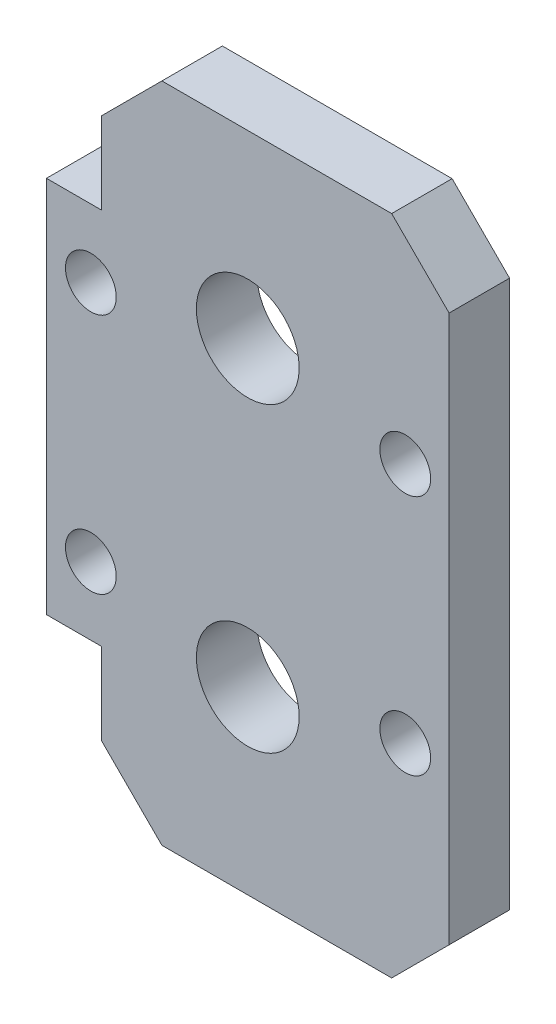
ISO-10303-21;
HEADER;
FILE_DESCRIPTION(('STEP AP214'),'2;1');
FILE_NAME('part.step','',(''),(''),'','','');
FILE_SCHEMA(('AUTOMOTIVE_DESIGN { 1 0 10303 214 1 1 1 1 }'));
ENDSEC;
DATA;
#1=APPLICATION_CONTEXT('core data for automotive mechanical design processes');
#2=APPLICATION_PROTOCOL_DEFINITION('international standard','automotive_design',2000,#1);
#3=PRODUCT_CONTEXT('',#1,'mechanical');
#4=PRODUCT('Part','Part','',(#3));
#5=PRODUCT_RELATED_PRODUCT_CATEGORY('part','',(#4));
#6=PRODUCT_DEFINITION_FORMATION('','',#4);
#7=PRODUCT_DEFINITION_CONTEXT('part definition',#1,'design');
#8=PRODUCT_DEFINITION('design','',#6,#7);
#9=PRODUCT_DEFINITION_SHAPE('','',#8);
#10=(LENGTH_UNIT() NAMED_UNIT(*) SI_UNIT(.MILLI.,.METRE.));
#11=(NAMED_UNIT(*) PLANE_ANGLE_UNIT() SI_UNIT($,.RADIAN.));
#12=(NAMED_UNIT(*) SI_UNIT($,.STERADIAN.) SOLID_ANGLE_UNIT());
#13=UNCERTAINTY_MEASURE_WITH_UNIT(LENGTH_MEASURE(1.E-05),#10,'distance_accuracy_value','');
#14=(GEOMETRIC_REPRESENTATION_CONTEXT(3) GLOBAL_UNCERTAINTY_ASSIGNED_CONTEXT((#13)) GLOBAL_UNIT_ASSIGNED_CONTEXT((#10,
#11,#12)) REPRESENTATION_CONTEXT('',''));
#15=CARTESIAN_POINT('',(0.,0.,0.));
#16=DIRECTION('',(0.,0.,1.));
#17=DIRECTION('',(1.,0.,0.));
#18=AXIS2_PLACEMENT_3D('',#15,#16,#17);
#19=CARTESIAN_POINT('',(0.,0.,5.));
#20=DIRECTION('',(0.,0.,1.));
#21=DIRECTION('',(1.,0.,0.));
#22=AXIS2_PLACEMENT_3D('',#19,#20,#21);
#23=PLANE('',#22);
#24=CARTESIAN_POINT('',(13.0236850069192,9.99869022073703,5.));
#25=DIRECTION('',(0.,0.,1.));
#26=DIRECTION('',(1.,0.,0.));
#27=AXIS2_PLACEMENT_3D('',#24,#25,#26);
#28=CIRCLE('',#27,2.1);
#29=CARTESIAN_POINT('',(15.1236850069192,9.99869022073703,5.));
#30=VERTEX_POINT('',#29);
#31=EDGE_CURVE('E315',#30,#30,#28,.T.);
#32=ORIENTED_EDGE('',*,*,#31,.F.);
#33=EDGE_LOOP('',(#32));
#34=FACE_BOUND('',#33,.T.);
#35=CARTESIAN_POINT('',(-12.9763005789078,-10.0012986914376,5.));
#36=DIRECTION('',(0.,0.,1.));
#37=DIRECTION('',(1.,0.,0.));
#38=AXIS2_PLACEMENT_3D('',#35,#36,#37);
#39=CIRCLE('',#38,2.1);
#40=CARTESIAN_POINT('',(-10.8763005789078,-10.0012986914376,5.));
#41=VERTEX_POINT('',#40);
#42=EDGE_CURVE('E312',#41,#41,#39,.T.);
#43=ORIENTED_EDGE('',*,*,#42,.F.);
#44=EDGE_LOOP('',(#43));
#45=FACE_BOUND('',#44,.T.);
#46=CARTESIAN_POINT('',(-12.9763005789078,9.99869022073703,5.));
#47=DIRECTION('',(0.,0.,1.));
#48=DIRECTION('',(1.,0.,0.));
#49=AXIS2_PLACEMENT_3D('',#46,#47,#48);
#50=CIRCLE('',#49,2.1);
#51=CARTESIAN_POINT('',(-10.8763005789078,9.99869022073703,5.));
#52=VERTEX_POINT('',#51);
#53=EDGE_CURVE('E292',#52,#52,#50,.T.);
#54=ORIENTED_EDGE('',*,*,#53,.F.);
#55=EDGE_LOOP('',(#54));
#56=FACE_BOUND('',#55,.T.);
#57=CARTESIAN_POINT('',(13.0236850069192,-10.0012986914376,5.));
#58=DIRECTION('',(0.,0.,1.));
#59=DIRECTION('',(1.,0.,0.));
#60=AXIS2_PLACEMENT_3D('',#57,#58,#59);
#61=CIRCLE('',#60,2.1);
#62=CARTESIAN_POINT('',(15.1236850069192,-10.0012986914376,5.));
#63=VERTEX_POINT('',#62);
#64=EDGE_CURVE('E308',#63,#63,#61,.T.);
#65=ORIENTED_EDGE('',*,*,#64,.F.);
#66=EDGE_LOOP('',(#65));
#67=FACE_BOUND('',#66,.T.);
#68=CARTESIAN_POINT('',(0.,12.485,5.));
#69=DIRECTION('',(0.,0.,1.));
#70=DIRECTION('',(-1.,0.,0.));
#71=AXIS2_PLACEMENT_3D('',#68,#69,#70);
#72=CIRCLE('',#71,4.25000000000001);
#73=CARTESIAN_POINT('',(-4.25000000000001,12.485,5.));
#74=VERTEX_POINT('',#73);
#75=EDGE_CURVE('E158',#74,#74,#72,.T.);
#76=ORIENTED_EDGE('',*,*,#75,.F.);
#77=EDGE_LOOP('',(#76));
#78=FACE_BOUND('',#77,.T.);
#79=DIRECTION('',(1.,0.,0.));
#80=VECTOR('',#79,1.);
#81=CARTESIAN_POINT('',(-7.09994432064375,-27.3750000000001,5.));
#82=LINE('',#81,#80);
#83=CARTESIAN_POINT('',(-7.09994432064375,-27.3750000000001,5.));
#84=VERTEX_POINT('',#83);
#85=CARTESIAN_POINT('',(11.9000556793563,-27.3750000000001,5.));
#86=VERTEX_POINT('',#85);
#87=EDGE_CURVE('E177',#84,#86,#82,.T.);
#88=ORIENTED_EDGE('',*,*,#87,.T.);
#89=DIRECTION('',(0.707106781186548,0.707106781186547,0.));
#90=VECTOR('',#89,1.);
#91=CARTESIAN_POINT('',(11.9000556793563,-27.3750000000001,5.));
#92=LINE('',#91,#90);
#93=CARTESIAN_POINT('',(16.6500556793564,-22.625,5.));
#94=VERTEX_POINT('',#93);
#95=EDGE_CURVE('E105',#86,#94,#92,.T.);
#96=ORIENTED_EDGE('',*,*,#95,.T.);
#97=DIRECTION('',(0.,1.,0.));
#98=VECTOR('',#97,1.);
#99=CARTESIAN_POINT('',(16.6500556793564,-22.625,5.));
#100=LINE('',#99,#98);
#101=CARTESIAN_POINT('',(16.6500556793564,22.625,5.));
#102=VERTEX_POINT('',#101);
#103=EDGE_CURVE('E204',#94,#102,#100,.T.);
#104=ORIENTED_EDGE('',*,*,#103,.T.);
#105=DIRECTION('',(-0.707106781186548,0.707106781186547,0.));
#106=VECTOR('',#105,1.);
#107=CARTESIAN_POINT('',(11.9000556793563,27.3750000000001,5.));
#108=LINE('',#107,#106);
#109=CARTESIAN_POINT('',(11.9000556793563,27.3750000000001,5.));
#110=VERTEX_POINT('',#109);
#111=EDGE_CURVE('E223',#102,#110,#108,.T.);
#112=ORIENTED_EDGE('',*,*,#111,.T.);
#113=DIRECTION('',(-1.,0.,0.));
#114=VECTOR('',#113,1.);
#115=CARTESIAN_POINT('',(-7.09994432064375,27.3750000000001,5.));
#116=LINE('',#115,#114);
#117=CARTESIAN_POINT('',(-7.09994432064375,27.3750000000001,5.));
#118=VERTEX_POINT('',#117);
#119=EDGE_CURVE('E220',#110,#118,#116,.T.);
#120=ORIENTED_EDGE('',*,*,#119,.T.);
#121=DIRECTION('',(-0.707106781186547,-0.707106781186548,0.));
#122=VECTOR('',#121,1.);
#123=CARTESIAN_POINT('',(-12.0999443206437,22.3750000000001,5.));
#124=LINE('',#123,#122);
#125=CARTESIAN_POINT('',(-12.0999443206437,22.3750000000001,5.));
#126=VERTEX_POINT('',#125);
#127=EDGE_CURVE('E222',#118,#126,#124,.T.);
#128=ORIENTED_EDGE('',*,*,#127,.T.);
#129=DIRECTION('',(0.,-1.,0.));
#130=VECTOR('',#129,1.);
#131=CARTESIAN_POINT('',(-12.0999443206437,15.625,5.));
#132=LINE('',#131,#130);
#133=CARTESIAN_POINT('',(-12.0999443206437,15.625,5.));
#134=VERTEX_POINT('',#133);
#135=EDGE_CURVE('E225',#126,#134,#132,.T.);
#136=ORIENTED_EDGE('',*,*,#135,.T.);
#137=DIRECTION('',(-1.,0.,0.));
#138=VECTOR('',#137,1.);
#139=CARTESIAN_POINT('',(-16.65,15.625,5.));
#140=LINE('',#139,#138);
#141=CARTESIAN_POINT('',(-16.65,15.625,5.));
#142=VERTEX_POINT('',#141);
#143=EDGE_CURVE('E231',#134,#142,#140,.T.);
#144=ORIENTED_EDGE('',*,*,#143,.T.);
#145=DIRECTION('',(0.,-1.,0.));
#146=VECTOR('',#145,1.);
#147=CARTESIAN_POINT('',(-16.65,-15.625,5.));
#148=LINE('',#147,#146);
#149=CARTESIAN_POINT('',(-16.65,-15.625,5.));
#150=VERTEX_POINT('',#149);
#151=EDGE_CURVE('E136',#142,#150,#148,.T.);
#152=ORIENTED_EDGE('',*,*,#151,.T.);
#153=DIRECTION('',(1.,0.,0.));
#154=VECTOR('',#153,1.);
#155=CARTESIAN_POINT('',(-16.65,-15.625,5.));
#156=LINE('',#155,#154);
#157=CARTESIAN_POINT('',(-12.0999443206437,-15.625,5.));
#158=VERTEX_POINT('',#157);
#159=EDGE_CURVE('E130',#150,#158,#156,.T.);
#160=ORIENTED_EDGE('',*,*,#159,.T.);
#161=DIRECTION('',(0.,-1.,0.));
#162=VECTOR('',#161,1.);
#163=CARTESIAN_POINT('',(-12.0999443206437,-15.625,5.));
#164=LINE('',#163,#162);
#165=CARTESIAN_POINT('',(-12.0999443206437,-22.3750000000001,5.));
#166=VERTEX_POINT('',#165);
#167=EDGE_CURVE('E134',#158,#166,#164,.T.);
#168=ORIENTED_EDGE('',*,*,#167,.T.);
#169=DIRECTION('',(0.707106781186547,-0.707106781186548,0.));
#170=VECTOR('',#169,1.);
#171=CARTESIAN_POINT('',(-12.0999443206437,-22.3750000000001,5.));
#172=LINE('',#171,#170);
#173=EDGE_CURVE('E50',#166,#84,#172,.T.);
#174=ORIENTED_EDGE('',*,*,#173,.T.);
#175=EDGE_LOOP('',(#88,#96,#104,#112,#120,#128,#136,#144,#152,#160,#168,#174));
#176=FACE_BOUND('',#175,.T.);
#177=CARTESIAN_POINT('',(0.,-12.485,5.));
#178=DIRECTION('',(0.,0.,1.));
#179=DIRECTION('',(1.,0.,0.));
#180=AXIS2_PLACEMENT_3D('',#177,#178,#179);
#181=CIRCLE('',#180,4.25000000000001);
#182=CARTESIAN_POINT('',(4.25000000000001,-12.485,5.));
#183=VERTEX_POINT('',#182);
#184=EDGE_CURVE('E319',#183,#183,#181,.T.);
#185=ORIENTED_EDGE('',*,*,#184,.F.);
#186=EDGE_LOOP('',(#185));
#187=FACE_BOUND('',#186,.T.);
#188=ADVANCED_FACE('F33',(#34,#45,#56,#67,#78,#176,#187),#23,.T.);
#189=CARTESIAN_POINT('',(0.,0.,0.));
#190=DIRECTION('',(0.,0.,1.));
#191=DIRECTION('',(1.,0.,0.));
#192=AXIS2_PLACEMENT_3D('',#189,#190,#191);
#193=PLANE('',#192);
#194=CARTESIAN_POINT('',(13.0236850069192,9.99869022073703,0.));
#195=DIRECTION('',(0.,0.,-1.));
#196=DIRECTION('',(-1.,0.,0.));
#197=AXIS2_PLACEMENT_3D('',#194,#195,#196);
#198=CIRCLE('',#197,2.1);
#199=CARTESIAN_POINT('',(10.9236850069192,9.99869022073703,0.));
#200=VERTEX_POINT('',#199);
#201=EDGE_CURVE('E300',#200,#200,#198,.T.);
#202=ORIENTED_EDGE('',*,*,#201,.F.);
#203=EDGE_LOOP('',(#202));
#204=FACE_BOUND('',#203,.T.);
#205=CARTESIAN_POINT('',(-12.9763005789078,-10.0012986914376,0.));
#206=DIRECTION('',(0.,0.,-1.));
#207=DIRECTION('',(-1.,0.,0.));
#208=AXIS2_PLACEMENT_3D('',#205,#206,#207);
#209=CIRCLE('',#208,2.1);
#210=CARTESIAN_POINT('',(-15.0763005789078,-10.0012986914376,0.));
#211=VERTEX_POINT('',#210);
#212=EDGE_CURVE('E297',#211,#211,#209,.T.);
#213=ORIENTED_EDGE('',*,*,#212,.F.);
#214=EDGE_LOOP('',(#213));
#215=FACE_BOUND('',#214,.T.);
#216=CARTESIAN_POINT('',(-12.9763005789078,9.99869022073703,0.));
#217=DIRECTION('',(0.,0.,-1.));
#218=DIRECTION('',(-1.,0.,0.));
#219=AXIS2_PLACEMENT_3D('',#216,#217,#218);
#220=CIRCLE('',#219,2.1);
#221=CARTESIAN_POINT('',(-15.0763005789078,9.99869022073703,0.));
#222=VERTEX_POINT('',#221);
#223=EDGE_CURVE('E295',#222,#222,#220,.T.);
#224=ORIENTED_EDGE('',*,*,#223,.F.);
#225=EDGE_LOOP('',(#224));
#226=FACE_BOUND('',#225,.T.);
#227=CARTESIAN_POINT('',(13.0236850069192,-10.0012986914376,0.));
#228=DIRECTION('',(0.,0.,-1.));
#229=DIRECTION('',(-1.,0.,0.));
#230=AXIS2_PLACEMENT_3D('',#227,#228,#229);
#231=CIRCLE('',#230,2.1);
#232=CARTESIAN_POINT('',(10.9236850069192,-10.0012986914376,0.));
#233=VERTEX_POINT('',#232);
#234=EDGE_CURVE('E304',#233,#233,#231,.T.);
#235=ORIENTED_EDGE('',*,*,#234,.F.);
#236=EDGE_LOOP('',(#235));
#237=FACE_BOUND('',#236,.T.);
#238=DIRECTION('',(1.,0.,0.));
#239=VECTOR('',#238,1.);
#240=CARTESIAN_POINT('',(-7.09994432064375,-27.3750000000001,0.));
#241=LINE('',#240,#239);
#242=CARTESIAN_POINT('',(-7.09994432064375,-27.3750000000001,0.));
#243=VERTEX_POINT('',#242);
#244=CARTESIAN_POINT('',(11.9000556793563,-27.3750000000001,0.));
#245=VERTEX_POINT('',#244);
#246=EDGE_CURVE('E154',#243,#245,#241,.T.);
#247=ORIENTED_EDGE('',*,*,#246,.F.);
#248=DIRECTION('',(0.707106781186547,-0.707106781186548,0.));
#249=VECTOR('',#248,1.);
#250=CARTESIAN_POINT('',(-12.0999443206437,-22.3750000000001,0.));
#251=LINE('',#250,#249);
#252=CARTESIAN_POINT('',(-12.0999443206437,-22.3750000000001,0.));
#253=VERTEX_POINT('',#252);
#254=EDGE_CURVE('E97',#253,#243,#251,.T.);
#255=ORIENTED_EDGE('',*,*,#254,.F.);
#256=DIRECTION('',(0.,-1.,0.));
#257=VECTOR('',#256,1.);
#258=CARTESIAN_POINT('',(-12.0999443206437,-15.625,0.));
#259=LINE('',#258,#257);
#260=CARTESIAN_POINT('',(-12.0999443206437,-15.625,0.));
#261=VERTEX_POINT('',#260);
#262=EDGE_CURVE('E91',#261,#253,#259,.T.);
#263=ORIENTED_EDGE('',*,*,#262,.F.);
#264=DIRECTION('',(1.,0.,0.));
#265=VECTOR('',#264,1.);
#266=CARTESIAN_POINT('',(-16.65,-15.625,0.));
#267=LINE('',#266,#265);
#268=CARTESIAN_POINT('',(-16.65,-15.625,0.));
#269=VERTEX_POINT('',#268);
#270=EDGE_CURVE('E144',#269,#261,#267,.T.);
#271=ORIENTED_EDGE('',*,*,#270,.F.);
#272=DIRECTION('',(0.,-1.,0.));
#273=VECTOR('',#272,1.);
#274=CARTESIAN_POINT('',(-16.65,-15.625,0.));
#275=LINE('',#274,#273);
#276=CARTESIAN_POINT('',(-16.65,15.625,0.));
#277=VERTEX_POINT('',#276);
#278=EDGE_CURVE('E172',#277,#269,#275,.T.);
#279=ORIENTED_EDGE('',*,*,#278,.F.);
#280=DIRECTION('',(-1.,0.,0.));
#281=VECTOR('',#280,1.);
#282=CARTESIAN_POINT('',(-16.65,15.625,0.));
#283=LINE('',#282,#281);
#284=CARTESIAN_POINT('',(-12.0999443206437,15.625,0.));
#285=VERTEX_POINT('',#284);
#286=EDGE_CURVE('E170',#285,#277,#283,.T.);
#287=ORIENTED_EDGE('',*,*,#286,.F.);
#288=DIRECTION('',(0.,-1.,0.));
#289=VECTOR('',#288,1.);
#290=CARTESIAN_POINT('',(-12.0999443206437,15.625,0.));
#291=LINE('',#290,#289);
#292=CARTESIAN_POINT('',(-12.0999443206437,22.3750000000001,0.));
#293=VERTEX_POINT('',#292);
#294=EDGE_CURVE('E168',#293,#285,#291,.T.);
#295=ORIENTED_EDGE('',*,*,#294,.F.);
#296=DIRECTION('',(-0.707106781186547,-0.707106781186548,0.));
#297=VECTOR('',#296,1.);
#298=CARTESIAN_POINT('',(-12.0999443206437,22.3750000000001,0.));
#299=LINE('',#298,#297);
#300=CARTESIAN_POINT('',(-7.09994432064375,27.3750000000001,0.));
#301=VERTEX_POINT('',#300);
#302=EDGE_CURVE('E166',#301,#293,#299,.T.);
#303=ORIENTED_EDGE('',*,*,#302,.F.);
#304=DIRECTION('',(-1.,0.,0.));
#305=VECTOR('',#304,1.);
#306=CARTESIAN_POINT('',(-7.09994432064375,27.3750000000001,0.));
#307=LINE('',#306,#305);
#308=CARTESIAN_POINT('',(11.9000556793563,27.3750000000001,0.));
#309=VERTEX_POINT('',#308);
#310=EDGE_CURVE('E164',#309,#301,#307,.T.);
#311=ORIENTED_EDGE('',*,*,#310,.F.);
#312=DIRECTION('',(-0.707106781186548,0.707106781186547,0.));
#313=VECTOR('',#312,1.);
#314=CARTESIAN_POINT('',(11.9000556793563,27.3750000000001,0.));
#315=LINE('',#314,#313);
#316=CARTESIAN_POINT('',(16.6500556793564,22.625,0.));
#317=VERTEX_POINT('',#316);
#318=EDGE_CURVE('E162',#317,#309,#315,.T.);
#319=ORIENTED_EDGE('',*,*,#318,.F.);
#320=DIRECTION('',(0.,1.,0.));
#321=VECTOR('',#320,1.);
#322=CARTESIAN_POINT('',(16.6500556793564,-22.625,0.));
#323=LINE('',#322,#321);
#324=CARTESIAN_POINT('',(16.6500556793564,-22.625,0.));
#325=VERTEX_POINT('',#324);
#326=EDGE_CURVE('E160',#325,#317,#323,.T.);
#327=ORIENTED_EDGE('',*,*,#326,.F.);
#328=DIRECTION('',(0.707106781186548,0.707106781186547,0.));
#329=VECTOR('',#328,1.);
#330=CARTESIAN_POINT('',(11.9000556793563,-27.3750000000001,0.));
#331=LINE('',#330,#329);
#332=EDGE_CURVE('E157',#245,#325,#331,.T.);
#333=ORIENTED_EDGE('',*,*,#332,.F.);
#334=EDGE_LOOP('',(#247,#255,#263,#271,#279,#287,#295,#303,#311,#319,#327,#333));
#335=FACE_BOUND('',#334,.T.);
#336=CARTESIAN_POINT('',(0.,12.485,0.));
#337=DIRECTION('',(0.,0.,1.));
#338=DIRECTION('',(-1.,0.,0.));
#339=AXIS2_PLACEMENT_3D('',#336,#337,#338);
#340=CIRCLE('',#339,4.25000000000001);
#341=CARTESIAN_POINT('',(-4.25000000000001,12.485,0.));
#342=VERTEX_POINT('',#341);
#343=EDGE_CURVE('E322',#342,#342,#340,.T.);
#344=ORIENTED_EDGE('',*,*,#343,.T.);
#345=EDGE_LOOP('',(#344));
#346=FACE_BOUND('',#345,.T.);
#347=CARTESIAN_POINT('',(0.,-12.485,0.));
#348=DIRECTION('',(0.,0.,1.));
#349=DIRECTION('',(1.,0.,0.));
#350=AXIS2_PLACEMENT_3D('',#347,#348,#349);
#351=CIRCLE('',#350,4.25000000000001);
#352=CARTESIAN_POINT('',(4.25000000000001,-12.485,0.));
#353=VERTEX_POINT('',#352);
#354=EDGE_CURVE('E318',#353,#353,#351,.T.);
#355=ORIENTED_EDGE('',*,*,#354,.T.);
#356=EDGE_LOOP('',(#355));
#357=FACE_BOUND('',#356,.T.);
#358=ADVANCED_FACE('F208',(#204,#215,#226,#237,#335,#346,#357),#193,.F.);
#359=CARTESIAN_POINT('',(-7.09994432064375,-27.3750000000001,5.));
#360=DIRECTION('',(0.,1.,0.));
#361=DIRECTION('',(0.,0.,1.));
#362=AXIS2_PLACEMENT_3D('',#359,#360,#361);
#363=PLANE('',#362);
#364=ORIENTED_EDGE('',*,*,#246,.T.);
#365=DIRECTION('',(0.,0.,-1.));
#366=VECTOR('',#365,1.);
#367=CARTESIAN_POINT('',(11.9000556793563,-27.3750000000001,5.));
#368=LINE('',#367,#366);
#369=EDGE_CURVE('E11',#86,#245,#368,.T.);
#370=ORIENTED_EDGE('',*,*,#369,.F.);
#371=ORIENTED_EDGE('',*,*,#87,.F.);
#372=DIRECTION('',(0.,0.,-1.));
#373=VECTOR('',#372,1.);
#374=CARTESIAN_POINT('',(-7.09994432064375,-27.3750000000001,5.));
#375=LINE('',#374,#373);
#376=EDGE_CURVE('E150',#84,#243,#375,.T.);
#377=ORIENTED_EDGE('',*,*,#376,.T.);
#378=EDGE_LOOP('',(#364,#370,#371,#377));
#379=FACE_BOUND('',#378,.T.);
#380=ADVANCED_FACE('F35',(#379),#363,.F.);
#381=CARTESIAN_POINT('',(11.9000556793563,-27.3750000000001,5.));
#382=DIRECTION('',(-0.707106781186547,0.707106781186548,0.));
#383=DIRECTION('',(-0.707106781186548,-0.707106781186547,0.));
#384=AXIS2_PLACEMENT_3D('',#381,#382,#383);
#385=PLANE('',#384);
#386=ORIENTED_EDGE('',*,*,#332,.T.);
#387=DIRECTION('',(0.,0.,-1.));
#388=VECTOR('',#387,1.);
#389=CARTESIAN_POINT('',(16.6500556793564,-22.625,5.));
#390=LINE('',#389,#388);
#391=EDGE_CURVE('E42',#94,#325,#390,.T.);
#392=ORIENTED_EDGE('',*,*,#391,.F.);
#393=ORIENTED_EDGE('',*,*,#95,.F.);
#394=ORIENTED_EDGE('',*,*,#369,.T.);
#395=EDGE_LOOP('',(#386,#392,#393,#394));
#396=FACE_BOUND('',#395,.T.);
#397=ADVANCED_FACE('F449',(#396),#385,.F.);
#398=CARTESIAN_POINT('',(16.6500556793564,-22.625,5.));
#399=DIRECTION('',(-1.,0.,0.));
#400=DIRECTION('',(0.,0.,1.));
#401=AXIS2_PLACEMENT_3D('',#398,#399,#400);
#402=PLANE('',#401);
#403=ORIENTED_EDGE('',*,*,#326,.T.);
#404=DIRECTION('',(0.,0.,-1.));
#405=VECTOR('',#404,1.);
#406=CARTESIAN_POINT('',(16.6500556793564,22.625,5.));
#407=LINE('',#406,#405);
#408=EDGE_CURVE('E196',#102,#317,#407,.T.);
#409=ORIENTED_EDGE('',*,*,#408,.F.);
#410=ORIENTED_EDGE('',*,*,#103,.F.);
#411=ORIENTED_EDGE('',*,*,#391,.T.);
#412=EDGE_LOOP('',(#403,#409,#410,#411));
#413=FACE_BOUND('',#412,.T.);
#414=ADVANCED_FACE('F202',(#413),#402,.F.);
#415=CARTESIAN_POINT('',(11.9000556793563,27.3750000000001,5.));
#416=DIRECTION('',(-0.707106781186547,-0.707106781186548,0.));
#417=DIRECTION('',(0.707106781186548,-0.707106781186547,0.));
#418=AXIS2_PLACEMENT_3D('',#415,#416,#417);
#419=PLANE('',#418);
#420=ORIENTED_EDGE('',*,*,#318,.T.);
#421=DIRECTION('',(0.,0.,-1.));
#422=VECTOR('',#421,1.);
#423=CARTESIAN_POINT('',(11.9000556793563,27.3750000000001,5.));
#424=LINE('',#423,#422);
#425=EDGE_CURVE('E193',#110,#309,#424,.T.);
#426=ORIENTED_EDGE('',*,*,#425,.F.);
#427=ORIENTED_EDGE('',*,*,#111,.F.);
#428=ORIENTED_EDGE('',*,*,#408,.T.);
#429=EDGE_LOOP('',(#420,#426,#427,#428));
#430=FACE_BOUND('',#429,.T.);
#431=ADVANCED_FACE('F214',(#430),#419,.F.);
#432=CARTESIAN_POINT('',(-7.09994432064375,27.3750000000001,5.));
#433=DIRECTION('',(0.,-1.,0.));
#434=DIRECTION('',(0.,0.,-1.));
#435=AXIS2_PLACEMENT_3D('',#432,#433,#434);
#436=PLANE('',#435);
#437=ORIENTED_EDGE('',*,*,#310,.T.);
#438=DIRECTION('',(0.,0.,-1.));
#439=VECTOR('',#438,1.);
#440=CARTESIAN_POINT('',(-7.09994432064375,27.3750000000001,5.));
#441=LINE('',#440,#439);
#442=EDGE_CURVE('E190',#118,#301,#441,.T.);
#443=ORIENTED_EDGE('',*,*,#442,.F.);
#444=ORIENTED_EDGE('',*,*,#119,.F.);
#445=ORIENTED_EDGE('',*,*,#425,.T.);
#446=EDGE_LOOP('',(#437,#443,#444,#445));
#447=FACE_BOUND('',#446,.T.);
#448=ADVANCED_FACE('F218',(#447),#436,.F.);
#449=CARTESIAN_POINT('',(-12.0999443206437,22.3750000000001,5.));
#450=DIRECTION('',(0.707106781186548,-0.707106781186547,0.));
#451=DIRECTION('',(0.707106781186547,0.707106781186548,0.));
#452=AXIS2_PLACEMENT_3D('',#449,#450,#451);
#453=PLANE('',#452);
#454=ORIENTED_EDGE('',*,*,#302,.T.);
#455=DIRECTION('',(0.,0.,-1.));
#456=VECTOR('',#455,1.);
#457=CARTESIAN_POINT('',(-12.0999443206437,22.3750000000001,5.));
#458=LINE('',#457,#456);
#459=EDGE_CURVE('E187',#126,#293,#458,.T.);
#460=ORIENTED_EDGE('',*,*,#459,.F.);
#461=ORIENTED_EDGE('',*,*,#127,.F.);
#462=ORIENTED_EDGE('',*,*,#442,.T.);
#463=EDGE_LOOP('',(#454,#460,#461,#462));
#464=FACE_BOUND('',#463,.T.);
#465=ADVANCED_FACE('F418',(#464),#453,.F.);
#466=CARTESIAN_POINT('',(-12.0999443206437,15.625,5.));
#467=DIRECTION('',(1.,0.,0.));
#468=DIRECTION('',(0.,1.,0.));
#469=AXIS2_PLACEMENT_3D('',#466,#467,#468);
#470=PLANE('',#469);
#471=ORIENTED_EDGE('',*,*,#294,.T.);
#472=DIRECTION('',(0.,0.,-1.));
#473=VECTOR('',#472,1.);
#474=CARTESIAN_POINT('',(-12.0999443206437,15.625,5.));
#475=LINE('',#474,#473);
#476=EDGE_CURVE('E184',#134,#285,#475,.T.);
#477=ORIENTED_EDGE('',*,*,#476,.F.);
#478=ORIENTED_EDGE('',*,*,#135,.F.);
#479=ORIENTED_EDGE('',*,*,#459,.T.);
#480=EDGE_LOOP('',(#471,#477,#478,#479));
#481=FACE_BOUND('',#480,.T.);
#482=ADVANCED_FACE('F410',(#481),#470,.F.);
#483=CARTESIAN_POINT('',(-16.65,15.625,5.));
#484=DIRECTION('',(0.,-1.,0.));
#485=DIRECTION('',(1.,0.,0.));
#486=AXIS2_PLACEMENT_3D('',#483,#484,#485);
#487=PLANE('',#486);
#488=ORIENTED_EDGE('',*,*,#286,.T.);
#489=DIRECTION('',(0.,0.,-1.));
#490=VECTOR('',#489,1.);
#491=CARTESIAN_POINT('',(-16.65,15.625,5.));
#492=LINE('',#491,#490);
#493=EDGE_CURVE('E181',#142,#277,#492,.T.);
#494=ORIENTED_EDGE('',*,*,#493,.F.);
#495=ORIENTED_EDGE('',*,*,#143,.F.);
#496=ORIENTED_EDGE('',*,*,#476,.T.);
#497=EDGE_LOOP('',(#488,#494,#495,#496));
#498=FACE_BOUND('',#497,.T.);
#499=ADVANCED_FACE('F237',(#498),#487,.F.);
#500=CARTESIAN_POINT('',(-16.65,-15.625,5.));
#501=DIRECTION('',(1.,0.,0.));
#502=DIRECTION('',(0.,0.,-1.));
#503=AXIS2_PLACEMENT_3D('',#500,#501,#502);
#504=PLANE('',#503);
#505=ORIENTED_EDGE('',*,*,#278,.T.);
#506=DIRECTION('',(0.,0.,-1.));
#507=VECTOR('',#506,1.);
#508=CARTESIAN_POINT('',(-16.65,-15.625,5.));
#509=LINE('',#508,#507);
#510=EDGE_CURVE('E145',#150,#269,#509,.T.);
#511=ORIENTED_EDGE('',*,*,#510,.F.);
#512=ORIENTED_EDGE('',*,*,#151,.F.);
#513=ORIENTED_EDGE('',*,*,#493,.T.);
#514=EDGE_LOOP('',(#505,#511,#512,#513));
#515=FACE_BOUND('',#514,.T.);
#516=ADVANCED_FACE('F241',(#515),#504,.F.);
#517=CARTESIAN_POINT('',(-16.65,-15.625,5.));
#518=DIRECTION('',(0.,1.,0.));
#519=DIRECTION('',(-1.,0.,0.));
#520=AXIS2_PLACEMENT_3D('',#517,#518,#519);
#521=PLANE('',#520);
#522=ORIENTED_EDGE('',*,*,#270,.T.);
#523=DIRECTION('',(0.,0.,-1.));
#524=VECTOR('',#523,1.);
#525=CARTESIAN_POINT('',(-12.0999443206437,-15.625,5.));
#526=LINE('',#525,#524);
#527=EDGE_CURVE('E141',#158,#261,#526,.T.);
#528=ORIENTED_EDGE('',*,*,#527,.F.);
#529=ORIENTED_EDGE('',*,*,#159,.F.);
#530=ORIENTED_EDGE('',*,*,#510,.T.);
#531=EDGE_LOOP('',(#522,#528,#529,#530));
#532=FACE_BOUND('',#531,.T.);
#533=ADVANCED_FACE('F142',(#532),#521,.F.);
#534=CARTESIAN_POINT('',(-12.0999443206437,-15.625,5.));
#535=DIRECTION('',(1.,0.,0.));
#536=DIRECTION('',(0.,1.,0.));
#537=AXIS2_PLACEMENT_3D('',#534,#535,#536);
#538=PLANE('',#537);
#539=ORIENTED_EDGE('',*,*,#262,.T.);
#540=DIRECTION('',(0.,0.,-1.));
#541=VECTOR('',#540,1.);
#542=CARTESIAN_POINT('',(-12.0999443206437,-22.3750000000001,5.));
#543=LINE('',#542,#541);
#544=EDGE_CURVE('E146',#166,#253,#543,.T.);
#545=ORIENTED_EDGE('',*,*,#544,.F.);
#546=ORIENTED_EDGE('',*,*,#167,.F.);
#547=ORIENTED_EDGE('',*,*,#527,.T.);
#548=EDGE_LOOP('',(#539,#545,#546,#547));
#549=FACE_BOUND('',#548,.T.);
#550=ADVANCED_FACE('F148',(#549),#538,.F.);
#551=CARTESIAN_POINT('',(-12.0999443206437,-22.3750000000001,5.));
#552=DIRECTION('',(0.707106781186548,0.707106781186547,0.));
#553=DIRECTION('',(-0.707106781186547,0.707106781186548,0.));
#554=AXIS2_PLACEMENT_3D('',#551,#552,#553);
#555=PLANE('',#554);
#556=ORIENTED_EDGE('',*,*,#254,.T.);
#557=ORIENTED_EDGE('',*,*,#376,.F.);
#558=ORIENTED_EDGE('',*,*,#173,.F.);
#559=ORIENTED_EDGE('',*,*,#544,.T.);
#560=EDGE_LOOP('',(#556,#557,#558,#559));
#561=FACE_BOUND('',#560,.T.);
#562=ADVANCED_FACE('F245',(#561),#555,.F.);
#563=CARTESIAN_POINT('',(0.,12.485,5.));
#564=DIRECTION('',(0.,0.,-1.));
#565=DIRECTION('',(-1.,0.,0.));
#566=AXIS2_PLACEMENT_3D('',#563,#564,#565);
#567=CYLINDRICAL_SURFACE('',#566,4.25000000000001);
#568=ORIENTED_EDGE('',*,*,#75,.T.);
#569=EDGE_LOOP('',(#568));
#570=FACE_BOUND('',#569,.T.);
#571=ORIENTED_EDGE('',*,*,#343,.F.);
#572=EDGE_LOOP('',(#571));
#573=FACE_BOUND('',#572,.T.);
#574=ADVANCED_FACE('F247',(#570,#573),#567,.F.);
#575=CARTESIAN_POINT('',(0.,-12.485,5.));
#576=DIRECTION('',(0.,0.,-1.));
#577=DIRECTION('',(-1.,0.,0.));
#578=AXIS2_PLACEMENT_3D('',#575,#576,#577);
#579=CYLINDRICAL_SURFACE('',#578,4.25000000000001);
#580=ORIENTED_EDGE('',*,*,#184,.T.);
#581=EDGE_LOOP('',(#580));
#582=FACE_BOUND('',#581,.T.);
#583=ORIENTED_EDGE('',*,*,#354,.F.);
#584=EDGE_LOOP('',(#583));
#585=FACE_BOUND('',#584,.T.);
#586=ADVANCED_FACE('F253',(#582,#585),#579,.F.);
#587=CARTESIAN_POINT('',(13.0236850069192,-10.0012986914376,10.));
#588=DIRECTION('',(0.,0.,-1.));
#589=DIRECTION('',(-1.,0.,0.));
#590=AXIS2_PLACEMENT_3D('',#587,#588,#589);
#591=CYLINDRICAL_SURFACE('',#590,2.1);
#592=ORIENTED_EDGE('',*,*,#64,.T.);
#593=EDGE_LOOP('',(#592));
#594=FACE_BOUND('',#593,.T.);
#595=ORIENTED_EDGE('',*,*,#234,.T.);
#596=EDGE_LOOP('',(#595));
#597=FACE_BOUND('',#596,.T.);
#598=ADVANCED_FACE('F271',(#594,#597),#591,.F.);
#599=CARTESIAN_POINT('',(-12.9763005789078,9.99869022073703,10.));
#600=DIRECTION('',(0.,0.,-1.));
#601=DIRECTION('',(-1.,0.,0.));
#602=AXIS2_PLACEMENT_3D('',#599,#600,#601);
#603=CYLINDRICAL_SURFACE('',#602,2.1);
#604=ORIENTED_EDGE('',*,*,#53,.T.);
#605=EDGE_LOOP('',(#604));
#606=FACE_BOUND('',#605,.T.);
#607=ORIENTED_EDGE('',*,*,#223,.T.);
#608=EDGE_LOOP('',(#607));
#609=FACE_BOUND('',#608,.T.);
#610=ADVANCED_FACE('F275',(#606,#609),#603,.F.);
#611=CARTESIAN_POINT('',(-12.9763005789078,-10.0012986914376,10.));
#612=DIRECTION('',(0.,0.,-1.));
#613=DIRECTION('',(-1.,0.,0.));
#614=AXIS2_PLACEMENT_3D('',#611,#612,#613);
#615=CYLINDRICAL_SURFACE('',#614,2.1);
#616=ORIENTED_EDGE('',*,*,#42,.T.);
#617=EDGE_LOOP('',(#616));
#618=FACE_BOUND('',#617,.T.);
#619=ORIENTED_EDGE('',*,*,#212,.T.);
#620=EDGE_LOOP('',(#619));
#621=FACE_BOUND('',#620,.T.);
#622=ADVANCED_FACE('F277',(#618,#621),#615,.F.);
#623=CARTESIAN_POINT('',(13.0236850069192,9.99869022073703,10.));
#624=DIRECTION('',(0.,0.,-1.));
#625=DIRECTION('',(-1.,0.,0.));
#626=AXIS2_PLACEMENT_3D('',#623,#624,#625);
#627=CYLINDRICAL_SURFACE('',#626,2.1);
#628=ORIENTED_EDGE('',*,*,#31,.T.);
#629=EDGE_LOOP('',(#628));
#630=FACE_BOUND('',#629,.T.);
#631=ORIENTED_EDGE('',*,*,#201,.T.);
#632=EDGE_LOOP('',(#631));
#633=FACE_BOUND('',#632,.T.);
#634=ADVANCED_FACE('F280',(#630,#633),#627,.F.);
#635=CLOSED_SHELL('',(#188,#358,#380,#397,#414,#431,#448,#465,#482,#499,#516,#533,#550,#562,
#574,#586,#598,#610,#622,#634));
#636=MANIFOLD_SOLID_BREP('B2',#635);
#637=ADVANCED_BREP_SHAPE_REPRESENTATION('',(#18,#636),#14);
#638=SHAPE_DEFINITION_REPRESENTATION(#9,#637);
ENDSEC;
END-ISO-10303-21;
